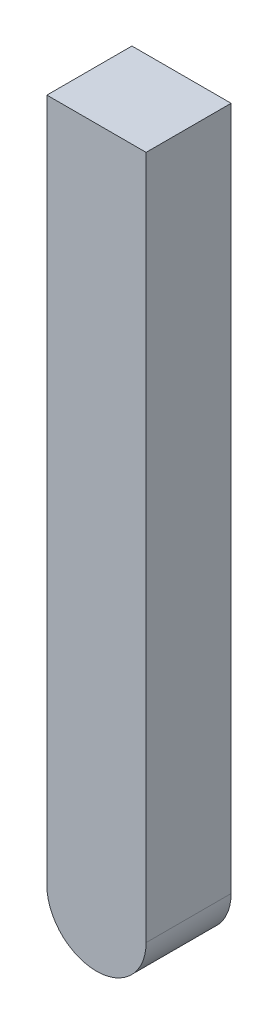
ISO-10303-21;
HEADER;
FILE_DESCRIPTION(('STEP AP214'),'2;1');
FILE_NAME('part.step','',(''),(''),'','','');
FILE_SCHEMA(('AUTOMOTIVE_DESIGN { 1 0 10303 214 1 1 1 1 }'));
ENDSEC;
DATA;
#1=APPLICATION_CONTEXT('core data for automotive mechanical design processes');
#2=APPLICATION_PROTOCOL_DEFINITION('international standard','automotive_design',2000,#1);
#3=PRODUCT_CONTEXT('',#1,'mechanical');
#4=PRODUCT('Part','Part','',(#3));
#5=PRODUCT_RELATED_PRODUCT_CATEGORY('part','',(#4));
#6=PRODUCT_DEFINITION_FORMATION('','',#4);
#7=PRODUCT_DEFINITION_CONTEXT('part definition',#1,'design');
#8=PRODUCT_DEFINITION('design','',#6,#7);
#9=PRODUCT_DEFINITION_SHAPE('','',#8);
#10=(LENGTH_UNIT() NAMED_UNIT(*) SI_UNIT(.MILLI.,.METRE.));
#11=(NAMED_UNIT(*) PLANE_ANGLE_UNIT() SI_UNIT($,.RADIAN.));
#12=(NAMED_UNIT(*) SI_UNIT($,.STERADIAN.) SOLID_ANGLE_UNIT());
#13=UNCERTAINTY_MEASURE_WITH_UNIT(LENGTH_MEASURE(1.E-05),#10,'distance_accuracy_value','');
#14=(GEOMETRIC_REPRESENTATION_CONTEXT(3) GLOBAL_UNCERTAINTY_ASSIGNED_CONTEXT((#13)) GLOBAL_UNIT_ASSIGNED_CONTEXT((#10,
#11,#12)) REPRESENTATION_CONTEXT('',''));
#15=CARTESIAN_POINT('',(0.,0.,0.));
#16=DIRECTION('',(0.,0.,1.));
#17=DIRECTION('',(1.,0.,0.));
#18=AXIS2_PLACEMENT_3D('',#15,#16,#17);
#19=CARTESIAN_POINT('',(0.350000000000001,2.415,0.3));
#20=DIRECTION('',(0.,-1.,0.));
#21=DIRECTION('',(0.,0.,-1.));
#22=AXIS2_PLACEMENT_3D('',#19,#20,#21);
#23=PLANE('',#22);
#24=DIRECTION('',(-1.,0.,0.));
#25=VECTOR('',#24,1.);
#26=CARTESIAN_POINT('',(0.350000000000001,2.415,-0.3));
#27=LINE('',#26,#25);
#28=CARTESIAN_POINT('',(0.350000000000001,2.415,-0.3));
#29=VERTEX_POINT('',#28);
#30=CARTESIAN_POINT('',(-0.349999999999999,2.415,-0.3));
#31=VERTEX_POINT('',#30);
#32=EDGE_CURVE('E96',#29,#31,#27,.T.);
#33=ORIENTED_EDGE('',*,*,#32,.T.);
#34=DIRECTION('',(0.,0.,-1.));
#35=VECTOR('',#34,1.);
#36=CARTESIAN_POINT('',(-0.349999999999999,2.415,0.3));
#37=LINE('',#36,#35);
#38=CARTESIAN_POINT('',(-0.349999999999999,2.415,0.3));
#39=VERTEX_POINT('',#38);
#40=EDGE_CURVE('E11',#39,#31,#37,.T.);
#41=ORIENTED_EDGE('',*,*,#40,.F.);
#42=DIRECTION('',(-1.,0.,0.));
#43=VECTOR('',#42,1.);
#44=CARTESIAN_POINT('',(0.350000000000001,2.415,0.3));
#45=LINE('',#44,#43);
#46=CARTESIAN_POINT('',(0.350000000000001,2.415,0.3));
#47=VERTEX_POINT('',#46);
#48=EDGE_CURVE('E84',#47,#39,#45,.T.);
#49=ORIENTED_EDGE('',*,*,#48,.F.);
#50=DIRECTION('',(0.,0.,-1.));
#51=VECTOR('',#50,1.);
#52=CARTESIAN_POINT('',(0.350000000000001,2.415,0.3));
#53=LINE('',#52,#51);
#54=EDGE_CURVE('E92',#47,#29,#53,.T.);
#55=ORIENTED_EDGE('',*,*,#54,.T.);
#56=EDGE_LOOP('',(#33,#41,#49,#55));
#57=FACE_BOUND('',#56,.T.);
#58=ADVANCED_FACE('F33',(#57),#23,.F.);
#59=CARTESIAN_POINT('',(-0.349999999999999,2.415,0.3));
#60=DIRECTION('',(1.,0.,0.));
#61=DIRECTION('',(0.,1.,0.));
#62=AXIS2_PLACEMENT_3D('',#59,#60,#61);
#63=PLANE('',#62);
#64=DIRECTION('',(0.,-1.,0.));
#65=VECTOR('',#64,1.);
#66=CARTESIAN_POINT('',(-0.349999999999999,2.415,-0.3));
#67=LINE('',#66,#65);
#68=CARTESIAN_POINT('',(-0.35,-2.415,-0.3));
#69=VERTEX_POINT('',#68);
#70=EDGE_CURVE('E88',#31,#69,#67,.T.);
#71=ORIENTED_EDGE('',*,*,#70,.T.);
#72=DIRECTION('',(0.,0.,-1.));
#73=VECTOR('',#72,1.);
#74=CARTESIAN_POINT('',(-0.35,-2.415,0.3));
#75=LINE('',#74,#73);
#76=CARTESIAN_POINT('',(-0.35,-2.415,0.3));
#77=VERTEX_POINT('',#76);
#78=EDGE_CURVE('E41',#77,#69,#75,.T.);
#79=ORIENTED_EDGE('',*,*,#78,.F.);
#80=DIRECTION('',(0.,-1.,0.));
#81=VECTOR('',#80,1.);
#82=CARTESIAN_POINT('',(-0.349999999999999,2.415,0.3));
#83=LINE('',#82,#81);
#84=EDGE_CURVE('E79',#39,#77,#83,.T.);
#85=ORIENTED_EDGE('',*,*,#84,.F.);
#86=ORIENTED_EDGE('',*,*,#40,.T.);
#87=EDGE_LOOP('',(#71,#79,#85,#86));
#88=FACE_BOUND('',#87,.T.);
#89=ADVANCED_FACE('F87',(#88),#63,.F.);
#90=CARTESIAN_POINT('',(0.,-2.415,0.3));
#91=DIRECTION('',(0.,0.,-1.));
#92=DIRECTION('',(-1.,0.,0.));
#93=AXIS2_PLACEMENT_3D('',#90,#91,#92);
#94=CYLINDRICAL_SURFACE('',#93,0.350000000000001);
#95=CARTESIAN_POINT('',(0.,-2.415,-0.3));
#96=DIRECTION('',(0.,0.,1.));
#97=DIRECTION('',(1.,0.,0.));
#98=AXIS2_PLACEMENT_3D('',#95,#96,#97);
#99=CIRCLE('',#98,0.350000000000001);
#100=CARTESIAN_POINT('',(0.350000000000001,-2.415,-0.3));
#101=VERTEX_POINT('',#100);
#102=EDGE_CURVE('E66',#69,#101,#99,.T.);
#103=ORIENTED_EDGE('',*,*,#102,.T.);
#104=DIRECTION('',(0.,0.,-1.));
#105=VECTOR('',#104,1.);
#106=CARTESIAN_POINT('',(0.350000000000001,-2.415,0.3));
#107=LINE('',#106,#105);
#108=CARTESIAN_POINT('',(0.350000000000001,-2.415,0.3));
#109=VERTEX_POINT('',#108);
#110=EDGE_CURVE('E89',#109,#101,#107,.T.);
#111=ORIENTED_EDGE('',*,*,#110,.F.);
#112=CARTESIAN_POINT('',(0.,-2.415,0.3));
#113=DIRECTION('',(0.,0.,1.));
#114=DIRECTION('',(1.,0.,0.));
#115=AXIS2_PLACEMENT_3D('',#112,#113,#114);
#116=CIRCLE('',#115,0.350000000000001);
#117=EDGE_CURVE('E82',#77,#109,#116,.T.);
#118=ORIENTED_EDGE('',*,*,#117,.F.);
#119=ORIENTED_EDGE('',*,*,#78,.T.);
#120=EDGE_LOOP('',(#103,#111,#118,#119));
#121=FACE_BOUND('',#120,.T.);
#122=ADVANCED_FACE('F90',(#121),#94,.T.);
#123=CARTESIAN_POINT('',(0.350000000000001,-2.415,0.3));
#124=DIRECTION('',(-1.,0.,0.));
#125=DIRECTION('',(0.,-1.,0.));
#126=AXIS2_PLACEMENT_3D('',#123,#124,#125);
#127=PLANE('',#126);
#128=DIRECTION('',(0.,1.,0.));
#129=VECTOR('',#128,1.);
#130=CARTESIAN_POINT('',(0.350000000000001,-2.415,-0.3));
#131=LINE('',#130,#129);
#132=EDGE_CURVE('E72',#101,#29,#131,.T.);
#133=ORIENTED_EDGE('',*,*,#132,.T.);
#134=ORIENTED_EDGE('',*,*,#54,.F.);
#135=DIRECTION('',(0.,1.,0.));
#136=VECTOR('',#135,1.);
#137=CARTESIAN_POINT('',(0.350000000000001,-2.415,0.3));
#138=LINE('',#137,#136);
#139=EDGE_CURVE('E49',#109,#47,#138,.T.);
#140=ORIENTED_EDGE('',*,*,#139,.F.);
#141=ORIENTED_EDGE('',*,*,#110,.T.);
#142=EDGE_LOOP('',(#133,#134,#140,#141));
#143=FACE_BOUND('',#142,.T.);
#144=ADVANCED_FACE('F103',(#143),#127,.F.);
#145=CARTESIAN_POINT('',(0.,-2.415,0.3));
#146=DIRECTION('',(0.,0.,1.));
#147=DIRECTION('',(1.,0.,0.));
#148=AXIS2_PLACEMENT_3D('',#145,#146,#147);
#149=PLANE('',#148);
#150=ORIENTED_EDGE('',*,*,#48,.T.);
#151=ORIENTED_EDGE('',*,*,#84,.T.);
#152=ORIENTED_EDGE('',*,*,#117,.T.);
#153=ORIENTED_EDGE('',*,*,#139,.T.);
#154=EDGE_LOOP('',(#150,#151,#152,#153));
#155=FACE_BOUND('',#154,.T.);
#156=ADVANCED_FACE('F80',(#155),#149,.T.);
#157=CARTESIAN_POINT('',(0.,-2.415,-0.3));
#158=DIRECTION('',(0.,0.,1.));
#159=DIRECTION('',(1.,0.,0.));
#160=AXIS2_PLACEMENT_3D('',#157,#158,#159);
#161=PLANE('',#160);
#162=ORIENTED_EDGE('',*,*,#32,.F.);
#163=ORIENTED_EDGE('',*,*,#132,.F.);
#164=ORIENTED_EDGE('',*,*,#102,.F.);
#165=ORIENTED_EDGE('',*,*,#70,.F.);
#166=EDGE_LOOP('',(#162,#163,#164,#165));
#167=FACE_BOUND('',#166,.T.);
#168=ADVANCED_FACE('F106',(#167),#161,.F.);
#169=CLOSED_SHELL('',(#58,#89,#122,#144,#156,#168));
#170=MANIFOLD_SOLID_BREP('B2',#169);
#171=ADVANCED_BREP_SHAPE_REPRESENTATION('',(#18,#170),#14);
#172=SHAPE_DEFINITION_REPRESENTATION(#9,#171);
ENDSEC;
END-ISO-10303-21;
